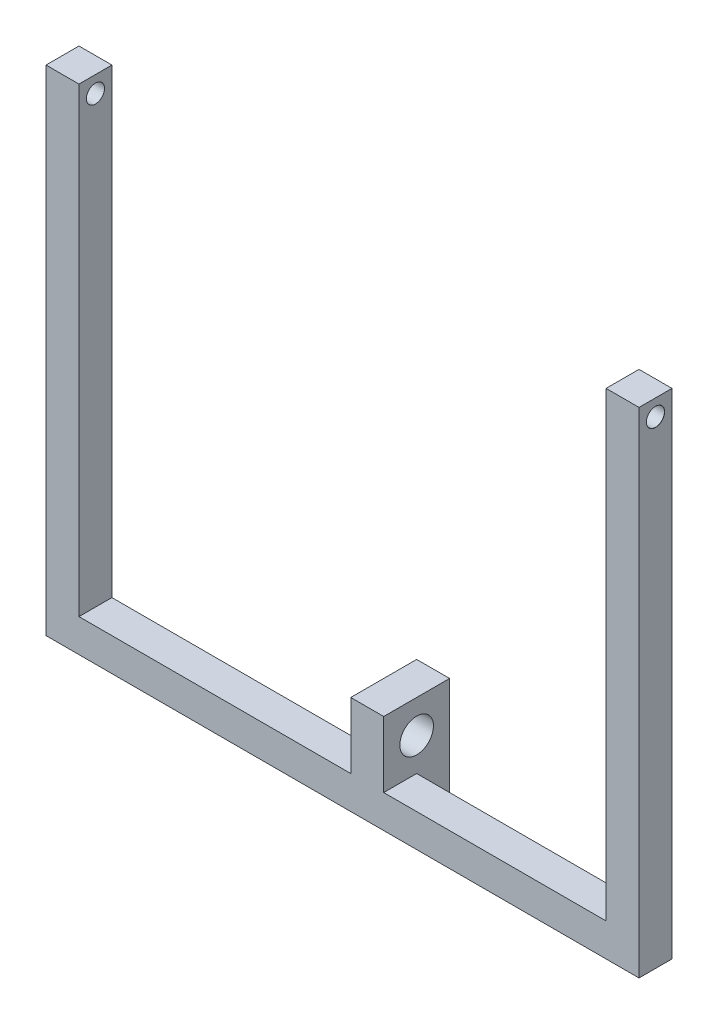
ISO-10303-21;
HEADER;
FILE_DESCRIPTION(('STEP AP214'),'2;1');
FILE_NAME('part.step','',(''),(''),'','','');
FILE_SCHEMA(('AUTOMOTIVE_DESIGN { 1 0 10303 214 1 1 1 1 }'));
ENDSEC;
DATA;
#1=APPLICATION_CONTEXT('core data for automotive mechanical design processes');
#2=APPLICATION_PROTOCOL_DEFINITION('international standard','automotive_design',2000,#1);
#3=PRODUCT_CONTEXT('',#1,'mechanical');
#4=PRODUCT('Part','Part','',(#3));
#5=PRODUCT_RELATED_PRODUCT_CATEGORY('part','',(#4));
#6=PRODUCT_DEFINITION_FORMATION('','',#4);
#7=PRODUCT_DEFINITION_CONTEXT('part definition',#1,'design');
#8=PRODUCT_DEFINITION('design','',#6,#7);
#9=PRODUCT_DEFINITION_SHAPE('','',#8);
#10=(LENGTH_UNIT() NAMED_UNIT(*) SI_UNIT(.MILLI.,.METRE.));
#11=(NAMED_UNIT(*) PLANE_ANGLE_UNIT() SI_UNIT($,.RADIAN.));
#12=(NAMED_UNIT(*) SI_UNIT($,.STERADIAN.) SOLID_ANGLE_UNIT());
#13=UNCERTAINTY_MEASURE_WITH_UNIT(LENGTH_MEASURE(1.E-05),#10,'distance_accuracy_value','');
#14=(GEOMETRIC_REPRESENTATION_CONTEXT(3) GLOBAL_UNCERTAINTY_ASSIGNED_CONTEXT((#13)) GLOBAL_UNIT_ASSIGNED_CONTEXT((#10,
#11,#12)) REPRESENTATION_CONTEXT('',''));
#15=CARTESIAN_POINT('',(0.,0.,0.));
#16=DIRECTION('',(0.,0.,1.));
#17=DIRECTION('',(1.,0.,0.));
#18=AXIS2_PLACEMENT_3D('',#15,#16,#17);
#19=CARTESIAN_POINT('',(0.,10.,0.));
#20=DIRECTION('',(0.,1.,0.));
#21=DIRECTION('',(0.,0.,1.));
#22=AXIS2_PLACEMENT_3D('',#19,#20,#21);
#23=PLANE('',#22);
#24=DIRECTION('',(-1.,0.,0.));
#25=VECTOR('',#24,1.);
#26=CARTESIAN_POINT('',(-90.,10.,-5.));
#27=LINE('',#26,#25);
#28=CARTESIAN_POINT('',(79.9999999999999,10.,-5.));
#29=VERTEX_POINT('',#28);
#30=CARTESIAN_POINT('',(12.5,10.,-5.));
#31=VERTEX_POINT('',#30);
#32=EDGE_CURVE('E224',#29,#31,#27,.T.);
#33=ORIENTED_EDGE('',*,*,#32,.T.);
#34=DIRECTION('',(0.,0.,-1.));
#35=VECTOR('',#34,1.);
#36=CARTESIAN_POINT('',(12.5,10.,-5.));
#37=LINE('',#36,#35);
#38=CARTESIAN_POINT('',(12.5,10.,5.));
#39=VERTEX_POINT('',#38);
#40=EDGE_CURVE('E275',#39,#31,#37,.T.);
#41=ORIENTED_EDGE('',*,*,#40,.F.);
#42=DIRECTION('',(1.,0.,0.));
#43=VECTOR('',#42,1.);
#44=CARTESIAN_POINT('',(-90.,10.,5.));
#45=LINE('',#44,#43);
#46=CARTESIAN_POINT('',(79.9999999999999,10.,5.));
#47=VERTEX_POINT('',#46);
#48=EDGE_CURVE('E226',#39,#47,#45,.T.);
#49=ORIENTED_EDGE('',*,*,#48,.T.);
#50=DIRECTION('',(0.,0.,1.));
#51=VECTOR('',#50,1.);
#52=CARTESIAN_POINT('',(80.,10.,-5.));
#53=LINE('',#52,#51);
#54=EDGE_CURVE('E192',#29,#47,#53,.T.);
#55=ORIENTED_EDGE('',*,*,#54,.F.);
#56=EDGE_LOOP('',(#33,#41,#49,#55));
#57=FACE_BOUND('',#56,.T.);
#58=ADVANCED_FACE('F39',(#57),#23,.T.);
#59=CARTESIAN_POINT('',(-90.,10.,-5.));
#60=DIRECTION('',(0.,0.,1.));
#61=DIRECTION('',(1.,0.,0.));
#62=AXIS2_PLACEMENT_3D('',#59,#60,#61);
#63=PLANE('',#62);
#64=DIRECTION('',(0.,-1.,0.));
#65=VECTOR('',#64,1.);
#66=CARTESIAN_POINT('',(12.5,0.,-5.));
#67=LINE('',#66,#65);
#68=CARTESIAN_POINT('',(12.5,0.,-5.));
#69=VERTEX_POINT('',#68);
#70=EDGE_CURVE('E63',#31,#69,#67,.T.);
#71=ORIENTED_EDGE('',*,*,#70,.F.);
#72=ORIENTED_EDGE('',*,*,#32,.F.);
#73=DIRECTION('',(0.,-1.,0.));
#74=VECTOR('',#73,1.);
#75=CARTESIAN_POINT('',(80.,150.,-5.));
#76=LINE('',#75,#74);
#77=CARTESIAN_POINT('',(80.,150.,-5.));
#78=VERTEX_POINT('',#77);
#79=EDGE_CURVE('E185',#78,#29,#76,.T.);
#80=ORIENTED_EDGE('',*,*,#79,.F.);
#81=DIRECTION('',(-1.,0.,0.));
#82=VECTOR('',#81,1.);
#83=CARTESIAN_POINT('',(90.,150.,-5.));
#84=LINE('',#83,#82);
#85=CARTESIAN_POINT('',(90.,150.,-5.));
#86=VERTEX_POINT('',#85);
#87=EDGE_CURVE('E201',#86,#78,#84,.T.);
#88=ORIENTED_EDGE('',*,*,#87,.F.);
#89=DIRECTION('',(0.,-1.,0.));
#90=VECTOR('',#89,1.);
#91=CARTESIAN_POINT('',(90.,10.,-5.));
#92=LINE('',#91,#90);
#93=CARTESIAN_POINT('',(90.,0.,-5.));
#94=VERTEX_POINT('',#93);
#95=EDGE_CURVE('E11',#86,#94,#92,.T.);
#96=ORIENTED_EDGE('',*,*,#95,.T.);
#97=DIRECTION('',(-1.,0.,0.));
#98=VECTOR('',#97,1.);
#99=CARTESIAN_POINT('',(-90.,0.,-5.));
#100=LINE('',#99,#98);
#101=EDGE_CURVE('E234',#94,#69,#100,.T.);
#102=ORIENTED_EDGE('',*,*,#101,.T.);
#103=EDGE_LOOP('',(#71,#72,#80,#88,#96,#102));
#104=FACE_BOUND('',#103,.T.);
#105=ADVANCED_FACE('F274',(#104),#63,.F.);
#106=DIRECTION('',(0.,0.,-1.));
#107=VECTOR('',#106,1.);
#108=CARTESIAN_POINT('',(2.5,10.,-5.));
#109=LINE('',#108,#107);
#110=CARTESIAN_POINT('',(2.49999999999997,10.,5.));
#111=VERTEX_POINT('',#110);
#112=CARTESIAN_POINT('',(2.49999999999997,10.,-5.));
#113=VERTEX_POINT('',#112);
#114=EDGE_CURVE('E55',#111,#113,#109,.T.);
#115=ORIENTED_EDGE('',*,*,#114,.T.);
#116=CARTESIAN_POINT('',(-80.,10.,-5.));
#117=VERTEX_POINT('',#116);
#118=EDGE_CURVE('E227',#113,#117,#27,.T.);
#119=ORIENTED_EDGE('',*,*,#118,.T.);
#120=DIRECTION('',(0.,0.,-1.));
#121=VECTOR('',#120,1.);
#122=CARTESIAN_POINT('',(-80.,10.,-5.));
#123=LINE('',#122,#121);
#124=CARTESIAN_POINT('',(-80.,10.,5.));
#125=VERTEX_POINT('',#124);
#126=EDGE_CURVE('E195',#125,#117,#123,.T.);
#127=ORIENTED_EDGE('',*,*,#126,.F.);
#128=EDGE_CURVE('E228',#125,#111,#45,.T.);
#129=ORIENTED_EDGE('',*,*,#128,.T.);
#130=EDGE_LOOP('',(#115,#119,#127,#129));
#131=FACE_BOUND('',#130,.T.);
#132=ADVANCED_FACE('F327',(#131),#23,.T.);
#133=CARTESIAN_POINT('',(90.,10.,-5.));
#134=DIRECTION('',(-1.,0.,0.));
#135=DIRECTION('',(0.,0.,1.));
#136=AXIS2_PLACEMENT_3D('',#133,#134,#135);
#137=PLANE('',#136);
#138=CARTESIAN_POINT('',(90.,145.,0.));
#139=DIRECTION('',(1.,0.,0.));
#140=DIRECTION('',(0.,0.,-1.));
#141=AXIS2_PLACEMENT_3D('',#138,#139,#140);
#142=CIRCLE('',#141,2.775);
#143=CARTESIAN_POINT('',(90.,145.,-2.775));
#144=VERTEX_POINT('',#143);
#145=EDGE_CURVE('E168',#144,#144,#142,.T.);
#146=ORIENTED_EDGE('',*,*,#145,.F.);
#147=EDGE_LOOP('',(#146));
#148=FACE_BOUND('',#147,.T.);
#149=DIRECTION('',(0.,0.,-1.));
#150=VECTOR('',#149,1.);
#151=CARTESIAN_POINT('',(90.,0.,-5.));
#152=LINE('',#151,#150);
#153=CARTESIAN_POINT('',(90.,0.,5.));
#154=VERTEX_POINT('',#153);
#155=EDGE_CURVE('E223',#154,#94,#152,.T.);
#156=ORIENTED_EDGE('',*,*,#155,.T.);
#157=ORIENTED_EDGE('',*,*,#95,.F.);
#158=DIRECTION('',(0.,0.,-1.));
#159=VECTOR('',#158,1.);
#160=CARTESIAN_POINT('',(90.,150.,-5.));
#161=LINE('',#160,#159);
#162=CARTESIAN_POINT('',(90.,150.,5.));
#163=VERTEX_POINT('',#162);
#164=EDGE_CURVE('E196',#163,#86,#161,.T.);
#165=ORIENTED_EDGE('',*,*,#164,.F.);
#166=DIRECTION('',(0.,-1.,0.));
#167=VECTOR('',#166,1.);
#168=CARTESIAN_POINT('',(90.,10.,5.));
#169=LINE('',#168,#167);
#170=EDGE_CURVE('E230',#163,#154,#169,.T.);
#171=ORIENTED_EDGE('',*,*,#170,.T.);
#172=EDGE_LOOP('',(#156,#157,#165,#171));
#173=FACE_BOUND('',#172,.T.);
#174=ADVANCED_FACE('F41',(#148,#173),#137,.F.);
#175=ORIENTED_EDGE('',*,*,#118,.F.);
#176=DIRECTION('',(0.,-1.,0.));
#177=VECTOR('',#176,1.);
#178=CARTESIAN_POINT('',(2.5,0.,-5.));
#179=LINE('',#178,#177);
#180=CARTESIAN_POINT('',(2.5,0.,-5.));
#181=VERTEX_POINT('',#180);
#182=EDGE_CURVE('E288',#113,#181,#179,.T.);
#183=ORIENTED_EDGE('',*,*,#182,.T.);
#184=CARTESIAN_POINT('',(-90.,0.,-5.));
#185=VERTEX_POINT('',#184);
#186=EDGE_CURVE('E233',#181,#185,#100,.T.);
#187=ORIENTED_EDGE('',*,*,#186,.T.);
#188=DIRECTION('',(0.,-1.,0.));
#189=VECTOR('',#188,1.);
#190=CARTESIAN_POINT('',(-90.,10.,-5.));
#191=LINE('',#190,#189);
#192=CARTESIAN_POINT('',(-90.,150.,-5.));
#193=VERTEX_POINT('',#192);
#194=EDGE_CURVE('E48',#193,#185,#191,.T.);
#195=ORIENTED_EDGE('',*,*,#194,.F.);
#196=DIRECTION('',(-1.,0.,0.));
#197=VECTOR('',#196,1.);
#198=CARTESIAN_POINT('',(-90.,150.,-5.));
#199=LINE('',#198,#197);
#200=CARTESIAN_POINT('',(-80.,150.,-5.));
#201=VERTEX_POINT('',#200);
#202=EDGE_CURVE('E212',#201,#193,#199,.T.);
#203=ORIENTED_EDGE('',*,*,#202,.F.);
#204=DIRECTION('',(0.,-1.,0.));
#205=VECTOR('',#204,1.);
#206=CARTESIAN_POINT('',(-80.,150.,-5.));
#207=LINE('',#206,#205);
#208=EDGE_CURVE('E215',#201,#117,#207,.T.);
#209=ORIENTED_EDGE('',*,*,#208,.T.);
#210=EDGE_LOOP('',(#175,#183,#187,#195,#203,#209));
#211=FACE_BOUND('',#210,.T.);
#212=ADVANCED_FACE('F332',(#211),#63,.F.);
#213=CARTESIAN_POINT('',(-90.,10.,-5.));
#214=DIRECTION('',(1.,0.,0.));
#215=DIRECTION('',(0.,0.,-1.));
#216=AXIS2_PLACEMENT_3D('',#213,#214,#215);
#217=PLANE('',#216);
#218=CARTESIAN_POINT('',(-90.,145.,0.));
#219=DIRECTION('',(1.,0.,0.));
#220=DIRECTION('',(0.,0.,-1.));
#221=AXIS2_PLACEMENT_3D('',#218,#219,#220);
#222=CIRCLE('',#221,2.74999999999995);
#223=CARTESIAN_POINT('',(-90.,145.,-2.74999999999995));
#224=VERTEX_POINT('',#223);
#225=EDGE_CURVE('E179',#224,#224,#222,.T.);
#226=ORIENTED_EDGE('',*,*,#225,.T.);
#227=EDGE_LOOP('',(#226));
#228=FACE_BOUND('',#227,.T.);
#229=DIRECTION('',(0.,0.,1.));
#230=VECTOR('',#229,1.);
#231=CARTESIAN_POINT('',(-90.,0.,-5.));
#232=LINE('',#231,#230);
#233=CARTESIAN_POINT('',(-90.,0.,5.));
#234=VERTEX_POINT('',#233);
#235=EDGE_CURVE('E236',#185,#234,#232,.T.);
#236=ORIENTED_EDGE('',*,*,#235,.T.);
#237=DIRECTION('',(0.,-1.,0.));
#238=VECTOR('',#237,1.);
#239=CARTESIAN_POINT('',(-90.,10.,5.));
#240=LINE('',#239,#238);
#241=CARTESIAN_POINT('',(-90.,150.,5.));
#242=VERTEX_POINT('',#241);
#243=EDGE_CURVE('E242',#242,#234,#240,.T.);
#244=ORIENTED_EDGE('',*,*,#243,.F.);
#245=DIRECTION('',(0.,0.,1.));
#246=VECTOR('',#245,1.);
#247=CARTESIAN_POINT('',(-90.,150.,-5.));
#248=LINE('',#247,#246);
#249=EDGE_CURVE('E205',#193,#242,#248,.T.);
#250=ORIENTED_EDGE('',*,*,#249,.F.);
#251=ORIENTED_EDGE('',*,*,#194,.T.);
#252=EDGE_LOOP('',(#236,#244,#250,#251));
#253=FACE_BOUND('',#252,.T.);
#254=ADVANCED_FACE('F249',(#228,#253),#217,.F.);
#255=CARTESIAN_POINT('',(-90.,10.,5.));
#256=DIRECTION('',(0.,0.,-1.));
#257=DIRECTION('',(-1.,0.,0.));
#258=AXIS2_PLACEMENT_3D('',#255,#256,#257);
#259=PLANE('',#258);
#260=DIRECTION('',(1.,0.,0.));
#261=VECTOR('',#260,1.);
#262=CARTESIAN_POINT('',(-90.,0.,5.));
#263=LINE('',#262,#261);
#264=EDGE_CURVE('E238',#234,#154,#263,.T.);
#265=ORIENTED_EDGE('',*,*,#264,.T.);
#266=ORIENTED_EDGE('',*,*,#170,.F.);
#267=DIRECTION('',(1.,0.,0.));
#268=VECTOR('',#267,1.);
#269=CARTESIAN_POINT('',(90.,150.,5.));
#270=LINE('',#269,#268);
#271=CARTESIAN_POINT('',(80.,150.,5.));
#272=VERTEX_POINT('',#271);
#273=EDGE_CURVE('E191',#272,#163,#270,.T.);
#274=ORIENTED_EDGE('',*,*,#273,.F.);
#275=DIRECTION('',(0.,-1.,0.));
#276=VECTOR('',#275,1.);
#277=CARTESIAN_POINT('',(80.,150.,5.));
#278=LINE('',#277,#276);
#279=EDGE_CURVE('E188',#272,#47,#278,.T.);
#280=ORIENTED_EDGE('',*,*,#279,.T.);
#281=ORIENTED_EDGE('',*,*,#48,.F.);
#282=DIRECTION('',(0.,-1.,0.));
#283=VECTOR('',#282,1.);
#284=CARTESIAN_POINT('',(12.5,10.,5.));
#285=LINE('',#284,#283);
#286=CARTESIAN_POINT('',(12.5,30.,5.));
#287=VERTEX_POINT('',#286);
#288=EDGE_CURVE('E153',#287,#39,#285,.T.);
#289=ORIENTED_EDGE('',*,*,#288,.F.);
#290=DIRECTION('',(-1.,0.,0.));
#291=VECTOR('',#290,1.);
#292=CARTESIAN_POINT('',(12.5,30.,5.));
#293=LINE('',#292,#291);
#294=CARTESIAN_POINT('',(2.5,30.,5.));
#295=VERTEX_POINT('',#294);
#296=EDGE_CURVE('E149',#287,#295,#293,.T.);
#297=ORIENTED_EDGE('',*,*,#296,.T.);
#298=DIRECTION('',(0.,-1.,0.));
#299=VECTOR('',#298,1.);
#300=CARTESIAN_POINT('',(2.5,10.,5.));
#301=LINE('',#300,#299);
#302=EDGE_CURVE('E284',#295,#111,#301,.T.);
#303=ORIENTED_EDGE('',*,*,#302,.T.);
#304=ORIENTED_EDGE('',*,*,#128,.F.);
#305=DIRECTION('',(0.,-1.,0.));
#306=VECTOR('',#305,1.);
#307=CARTESIAN_POINT('',(-80.,150.,5.));
#308=LINE('',#307,#306);
#309=CARTESIAN_POINT('',(-80.,150.,5.));
#310=VERTEX_POINT('',#309);
#311=EDGE_CURVE('E220',#310,#125,#308,.T.);
#312=ORIENTED_EDGE('',*,*,#311,.F.);
#313=DIRECTION('',(1.,0.,0.));
#314=VECTOR('',#313,1.);
#315=CARTESIAN_POINT('',(-90.,150.,5.));
#316=LINE('',#315,#314);
#317=EDGE_CURVE('E208',#242,#310,#316,.T.);
#318=ORIENTED_EDGE('',*,*,#317,.F.);
#319=ORIENTED_EDGE('',*,*,#243,.T.);
#320=EDGE_LOOP('',(#265,#266,#274,#280,#281,#289,#297,#303,#304,#312,#318,#319));
#321=FACE_BOUND('',#320,.T.);
#322=ADVANCED_FACE('F258',(#321),#259,.F.);
#323=CARTESIAN_POINT('',(0.,0.,0.));
#324=DIRECTION('',(0.,1.,0.));
#325=DIRECTION('',(0.,0.,1.));
#326=AXIS2_PLACEMENT_3D('',#323,#324,#325);
#327=PLANE('',#326);
#328=ORIENTED_EDGE('',*,*,#155,.F.);
#329=ORIENTED_EDGE('',*,*,#264,.F.);
#330=ORIENTED_EDGE('',*,*,#235,.F.);
#331=ORIENTED_EDGE('',*,*,#186,.F.);
#332=DIRECTION('',(0.,0.,-1.));
#333=VECTOR('',#332,1.);
#334=CARTESIAN_POINT('',(2.5,0.,-5.));
#335=LINE('',#334,#333);
#336=CARTESIAN_POINT('',(2.5,0.,-15.));
#337=VERTEX_POINT('',#336);
#338=EDGE_CURVE('E163',#181,#337,#335,.T.);
#339=ORIENTED_EDGE('',*,*,#338,.T.);
#340=DIRECTION('',(-1.,0.,0.));
#341=VECTOR('',#340,1.);
#342=CARTESIAN_POINT('',(12.5,0.,-15.));
#343=LINE('',#342,#341);
#344=CARTESIAN_POINT('',(12.5,0.,-15.));
#345=VERTEX_POINT('',#344);
#346=EDGE_CURVE('E173',#345,#337,#343,.T.);
#347=ORIENTED_EDGE('',*,*,#346,.F.);
#348=DIRECTION('',(0.,0.,-1.));
#349=VECTOR('',#348,1.);
#350=CARTESIAN_POINT('',(12.5,0.,-5.));
#351=LINE('',#350,#349);
#352=EDGE_CURVE('E159',#69,#345,#351,.T.);
#353=ORIENTED_EDGE('',*,*,#352,.F.);
#354=ORIENTED_EDGE('',*,*,#101,.F.);
#355=EDGE_LOOP('',(#328,#329,#330,#331,#339,#347,#353,#354));
#356=FACE_BOUND('',#355,.T.);
#357=ADVANCED_FACE('F255',(#356),#327,.F.);
#358=CARTESIAN_POINT('',(-80.,150.,-5.));
#359=DIRECTION('',(-1.,0.,0.));
#360=DIRECTION('',(0.,0.,1.));
#361=AXIS2_PLACEMENT_3D('',#358,#359,#360);
#362=PLANE('',#361);
#363=CARTESIAN_POINT('',(-80.,145.,0.));
#364=DIRECTION('',(-1.,0.,0.));
#365=DIRECTION('',(0.,0.,1.));
#366=AXIS2_PLACEMENT_3D('',#363,#364,#365);
#367=CIRCLE('',#366,2.74999999999996);
#368=CARTESIAN_POINT('',(-80.,145.,2.74999999999996));
#369=VERTEX_POINT('',#368);
#370=EDGE_CURVE('E182',#369,#369,#367,.T.);
#371=ORIENTED_EDGE('',*,*,#370,.T.);
#372=EDGE_LOOP('',(#371));
#373=FACE_BOUND('',#372,.T.);
#374=ORIENTED_EDGE('',*,*,#126,.T.);
#375=ORIENTED_EDGE('',*,*,#208,.F.);
#376=DIRECTION('',(0.,0.,-1.));
#377=VECTOR('',#376,1.);
#378=CARTESIAN_POINT('',(-80.,150.,-5.));
#379=LINE('',#378,#377);
#380=EDGE_CURVE('E210',#310,#201,#379,.T.);
#381=ORIENTED_EDGE('',*,*,#380,.F.);
#382=ORIENTED_EDGE('',*,*,#311,.T.);
#383=EDGE_LOOP('',(#374,#375,#381,#382));
#384=FACE_BOUND('',#383,.T.);
#385=ADVANCED_FACE('F368',(#373,#384),#362,.F.);
#386=CARTESIAN_POINT('',(0.,150.,0.));
#387=DIRECTION('',(0.,1.,0.));
#388=DIRECTION('',(0.,0.,1.));
#389=AXIS2_PLACEMENT_3D('',#386,#387,#388);
#390=PLANE('',#389);
#391=ORIENTED_EDGE('',*,*,#249,.T.);
#392=ORIENTED_EDGE('',*,*,#317,.T.);
#393=ORIENTED_EDGE('',*,*,#380,.T.);
#394=ORIENTED_EDGE('',*,*,#202,.T.);
#395=EDGE_LOOP('',(#391,#392,#393,#394));
#396=FACE_BOUND('',#395,.T.);
#397=ADVANCED_FACE('F364',(#396),#390,.T.);
#398=CARTESIAN_POINT('',(80.,150.,-5.));
#399=DIRECTION('',(1.,0.,0.));
#400=DIRECTION('',(0.,0.,-1.));
#401=AXIS2_PLACEMENT_3D('',#398,#399,#400);
#402=PLANE('',#401);
#403=CARTESIAN_POINT('',(80.,145.,0.));
#404=DIRECTION('',(1.,0.,0.));
#405=DIRECTION('',(0.,0.,-1.));
#406=AXIS2_PLACEMENT_3D('',#403,#404,#405);
#407=CIRCLE('',#406,2.74999999999996);
#408=CARTESIAN_POINT('',(80.,145.,-2.74999999999996));
#409=VERTEX_POINT('',#408);
#410=EDGE_CURVE('E43',#409,#409,#407,.T.);
#411=ORIENTED_EDGE('',*,*,#410,.T.);
#412=EDGE_LOOP('',(#411));
#413=FACE_BOUND('',#412,.T.);
#414=ORIENTED_EDGE('',*,*,#54,.T.);
#415=ORIENTED_EDGE('',*,*,#279,.F.);
#416=DIRECTION('',(0.,0.,1.));
#417=VECTOR('',#416,1.);
#418=CARTESIAN_POINT('',(80.,150.,-5.));
#419=LINE('',#418,#417);
#420=EDGE_CURVE('E199',#78,#272,#419,.T.);
#421=ORIENTED_EDGE('',*,*,#420,.F.);
#422=ORIENTED_EDGE('',*,*,#79,.T.);
#423=EDGE_LOOP('',(#414,#415,#421,#422));
#424=FACE_BOUND('',#423,.T.);
#425=ADVANCED_FACE('F271',(#413,#424),#402,.F.);
#426=CARTESIAN_POINT('',(0.,150.,0.));
#427=DIRECTION('',(0.,-1.,0.));
#428=DIRECTION('',(0.,0.,-1.));
#429=AXIS2_PLACEMENT_3D('',#426,#427,#428);
#430=PLANE('',#429);
#431=ORIENTED_EDGE('',*,*,#164,.T.);
#432=ORIENTED_EDGE('',*,*,#87,.T.);
#433=ORIENTED_EDGE('',*,*,#420,.T.);
#434=ORIENTED_EDGE('',*,*,#273,.T.);
#435=EDGE_LOOP('',(#431,#432,#433,#434));
#436=FACE_BOUND('',#435,.T.);
#437=ADVANCED_FACE('F265',(#436),#430,.F.);
#438=CARTESIAN_POINT('',(90.,145.,0.));
#439=DIRECTION('',(1.,0.,0.));
#440=DIRECTION('',(0.,0.,-1.));
#441=AXIS2_PLACEMENT_3D('',#438,#439,#440);
#442=CYLINDRICAL_SURFACE('',#441,2.74999999999996);
#443=CARTESIAN_POINT('',(89.975,145.,0.));
#444=DIRECTION('',(1.,0.,0.));
#445=DIRECTION('',(0.,0.,-1.));
#446=AXIS2_PLACEMENT_3D('',#443,#444,#445);
#447=CIRCLE('',#446,2.74999999999997);
#448=CARTESIAN_POINT('',(89.975,145.,-2.74999999999997));
#449=VERTEX_POINT('',#448);
#450=EDGE_CURVE('E171',#449,#449,#447,.T.);
#451=ORIENTED_EDGE('',*,*,#450,.T.);
#452=EDGE_LOOP('',(#451));
#453=FACE_BOUND('',#452,.T.);
#454=ORIENTED_EDGE('',*,*,#410,.F.);
#455=EDGE_LOOP('',(#454));
#456=FACE_BOUND('',#455,.T.);
#457=ADVANCED_FACE('F350',(#453,#456),#442,.F.);
#458=CARTESIAN_POINT('',(90.,145.,0.));
#459=DIRECTION('',(1.,0.,0.));
#460=DIRECTION('',(0.,0.,-1.));
#461=AXIS2_PLACEMENT_3D('',#458,#459,#460);
#462=CONICAL_SURFACE('',#461,2.775,0.785398163397448);
#463=ORIENTED_EDGE('',*,*,#450,.F.);
#464=EDGE_LOOP('',(#463));
#465=FACE_BOUND('',#464,.T.);
#466=ORIENTED_EDGE('',*,*,#145,.T.);
#467=EDGE_LOOP('',(#466));
#468=FACE_BOUND('',#467,.T.);
#469=ADVANCED_FACE('F347',(#465,#468),#462,.F.);
#470=ORIENTED_EDGE('',*,*,#225,.F.);
#471=EDGE_LOOP('',(#470));
#472=FACE_BOUND('',#471,.T.);
#473=ORIENTED_EDGE('',*,*,#370,.F.);
#474=EDGE_LOOP('',(#473));
#475=FACE_BOUND('',#474,.T.);
#476=ADVANCED_FACE('F349',(#472,#475),#442,.F.);
#477=CARTESIAN_POINT('',(12.5,0.,-15.));
#478=DIRECTION('',(0.,0.,1.));
#479=DIRECTION('',(1.,0.,0.));
#480=AXIS2_PLACEMENT_3D('',#477,#478,#479);
#481=PLANE('',#480);
#482=DIRECTION('',(0.,1.,0.));
#483=VECTOR('',#482,1.);
#484=CARTESIAN_POINT('',(2.5,0.,-15.));
#485=LINE('',#484,#483);
#486=CARTESIAN_POINT('',(2.5,30.,-15.));
#487=VERTEX_POINT('',#486);
#488=EDGE_CURVE('E167',#337,#487,#485,.T.);
#489=ORIENTED_EDGE('',*,*,#488,.T.);
#490=DIRECTION('',(-1.,0.,0.));
#491=VECTOR('',#490,1.);
#492=CARTESIAN_POINT('',(12.5,30.,-15.));
#493=LINE('',#492,#491);
#494=CARTESIAN_POINT('',(12.5,30.,-15.));
#495=VERTEX_POINT('',#494);
#496=EDGE_CURVE('E146',#495,#487,#493,.T.);
#497=ORIENTED_EDGE('',*,*,#496,.F.);
#498=DIRECTION('',(0.,1.,0.));
#499=VECTOR('',#498,1.);
#500=CARTESIAN_POINT('',(12.5,0.,-15.));
#501=LINE('',#500,#499);
#502=EDGE_CURVE('E154',#345,#495,#501,.T.);
#503=ORIENTED_EDGE('',*,*,#502,.F.);
#504=ORIENTED_EDGE('',*,*,#346,.T.);
#505=EDGE_LOOP('',(#489,#497,#503,#504));
#506=FACE_BOUND('',#505,.T.);
#507=ADVANCED_FACE('F165',(#506),#481,.F.);
#508=CARTESIAN_POINT('',(12.5,30.,5.));
#509=DIRECTION('',(0.,-1.,0.));
#510=DIRECTION('',(0.,0.,-1.));
#511=AXIS2_PLACEMENT_3D('',#508,#509,#510);
#512=PLANE('',#511);
#513=DIRECTION('',(0.,0.,1.));
#514=VECTOR('',#513,1.);
#515=CARTESIAN_POINT('',(2.5,30.,5.));
#516=LINE('',#515,#514);
#517=EDGE_CURVE('E281',#487,#295,#516,.T.);
#518=ORIENTED_EDGE('',*,*,#517,.T.);
#519=ORIENTED_EDGE('',*,*,#296,.F.);
#520=DIRECTION('',(0.,0.,1.));
#521=VECTOR('',#520,1.);
#522=CARTESIAN_POINT('',(12.5,30.,5.));
#523=LINE('',#522,#521);
#524=EDGE_CURVE('E142',#495,#287,#523,.T.);
#525=ORIENTED_EDGE('',*,*,#524,.F.);
#526=ORIENTED_EDGE('',*,*,#496,.T.);
#527=EDGE_LOOP('',(#518,#519,#525,#526));
#528=FACE_BOUND('',#527,.T.);
#529=ADVANCED_FACE('F144',(#528),#512,.F.);
#530=CARTESIAN_POINT('',(12.5,0.,0.));
#531=DIRECTION('',(-1.,0.,0.));
#532=DIRECTION('',(0.,0.,1.));
#533=AXIS2_PLACEMENT_3D('',#530,#531,#532);
#534=PLANE('',#533);
#535=CARTESIAN_POINT('',(12.5,20.,-5.));
#536=DIRECTION('',(-1.,0.,0.));
#537=DIRECTION('',(0.,0.,1.));
#538=AXIS2_PLACEMENT_3D('',#535,#536,#537);
#539=CIRCLE('',#538,5.10000000000001);
#540=CARTESIAN_POINT('',(12.5,20.,0.100000000000012));
#541=VERTEX_POINT('',#540);
#542=EDGE_CURVE('E282',#541,#541,#539,.T.);
#543=ORIENTED_EDGE('',*,*,#542,.T.);
#544=EDGE_LOOP('',(#543));
#545=FACE_BOUND('',#544,.T.);
#546=ORIENTED_EDGE('',*,*,#502,.T.);
#547=ORIENTED_EDGE('',*,*,#524,.T.);
#548=ORIENTED_EDGE('',*,*,#288,.T.);
#549=ORIENTED_EDGE('',*,*,#40,.T.);
#550=ORIENTED_EDGE('',*,*,#70,.T.);
#551=ORIENTED_EDGE('',*,*,#352,.T.);
#552=EDGE_LOOP('',(#546,#547,#548,#549,#550,#551));
#553=FACE_BOUND('',#552,.T.);
#554=ADVANCED_FACE('F157',(#545,#553),#534,.F.);
#555=CARTESIAN_POINT('',(2.5,0.,0.));
#556=DIRECTION('',(-1.,0.,0.));
#557=DIRECTION('',(0.,0.,1.));
#558=AXIS2_PLACEMENT_3D('',#555,#556,#557);
#559=PLANE('',#558);
#560=CARTESIAN_POINT('',(2.5,20.,-5.));
#561=DIRECTION('',(-1.,0.,0.));
#562=DIRECTION('',(0.,0.,1.));
#563=AXIS2_PLACEMENT_3D('',#560,#561,#562);
#564=CIRCLE('',#563,5.70000000000001);
#565=CARTESIAN_POINT('',(2.5,20.,0.700000000000013));
#566=VERTEX_POINT('',#565);
#567=EDGE_CURVE('E306',#566,#566,#564,.T.);
#568=ORIENTED_EDGE('',*,*,#567,.F.);
#569=EDGE_LOOP('',(#568));
#570=FACE_BOUND('',#569,.T.);
#571=ORIENTED_EDGE('',*,*,#488,.F.);
#572=ORIENTED_EDGE('',*,*,#338,.F.);
#573=ORIENTED_EDGE('',*,*,#182,.F.);
#574=ORIENTED_EDGE('',*,*,#114,.F.);
#575=ORIENTED_EDGE('',*,*,#302,.F.);
#576=ORIENTED_EDGE('',*,*,#517,.F.);
#577=EDGE_LOOP('',(#571,#572,#573,#574,#575,#576));
#578=FACE_BOUND('',#577,.T.);
#579=ADVANCED_FACE('F293',(#570,#578),#559,.T.);
#580=CARTESIAN_POINT('',(2.5,20.,-5.));
#581=DIRECTION('',(-1.,0.,0.));
#582=DIRECTION('',(0.,0.,1.));
#583=AXIS2_PLACEMENT_3D('',#580,#581,#582);
#584=CYLINDRICAL_SURFACE('',#583,5.10000000000001);
#585=ORIENTED_EDGE('',*,*,#542,.F.);
#586=EDGE_LOOP('',(#585));
#587=FACE_BOUND('',#586,.T.);
#588=CARTESIAN_POINT('',(3.1,20.,-5.));
#589=DIRECTION('',(-1.,0.,0.));
#590=DIRECTION('',(0.,0.,1.));
#591=AXIS2_PLACEMENT_3D('',#588,#589,#590);
#592=CIRCLE('',#591,5.10000000000001);
#593=CARTESIAN_POINT('',(3.1,20.,0.10000000000001));
#594=VERTEX_POINT('',#593);
#595=EDGE_CURVE('E300',#594,#594,#592,.T.);
#596=ORIENTED_EDGE('',*,*,#595,.T.);
#597=EDGE_LOOP('',(#596));
#598=FACE_BOUND('',#597,.T.);
#599=ADVANCED_FACE('F313',(#587,#598),#584,.F.);
#600=CARTESIAN_POINT('',(3.1,25.1,-5.));
#601=DIRECTION('',(1.,0.,0.));
#602=DIRECTION('',(0.,0.,-1.));
#603=AXIS2_PLACEMENT_3D('',#600,#601,#602);
#604=PLANE('',#603);
#605=ORIENTED_EDGE('',*,*,#595,.F.);
#606=EDGE_LOOP('',(#605));
#607=FACE_BOUND('',#606,.T.);
#608=CARTESIAN_POINT('',(3.1,20.,-5.));
#609=DIRECTION('',(-1.,0.,0.));
#610=DIRECTION('',(0.,0.,1.));
#611=AXIS2_PLACEMENT_3D('',#608,#609,#610);
#612=CIRCLE('',#611,5.70000000000001);
#613=CARTESIAN_POINT('',(3.1,20.,0.700000000000013));
#614=VERTEX_POINT('',#613);
#615=EDGE_CURVE('E303',#614,#614,#612,.T.);
#616=ORIENTED_EDGE('',*,*,#615,.T.);
#617=EDGE_LOOP('',(#616));
#618=FACE_BOUND('',#617,.T.);
#619=ADVANCED_FACE('F319',(#607,#618),#604,.F.);
#620=CARTESIAN_POINT('',(2.5,20.,-5.));
#621=DIRECTION('',(-1.,0.,0.));
#622=DIRECTION('',(0.,0.,1.));
#623=AXIS2_PLACEMENT_3D('',#620,#621,#622);
#624=CYLINDRICAL_SURFACE('',#623,5.70000000000001);
#625=ORIENTED_EDGE('',*,*,#615,.F.);
#626=EDGE_LOOP('',(#625));
#627=FACE_BOUND('',#626,.T.);
#628=ORIENTED_EDGE('',*,*,#567,.T.);
#629=EDGE_LOOP('',(#628));
#630=FACE_BOUND('',#629,.T.);
#631=ADVANCED_FACE('F310',(#627,#630),#624,.F.);
#632=CLOSED_SHELL('',(#58,#105,#132,#174,#212,#254,#322,#357,#385,#397,#425,#437,#457,#469,#476,
#507,#529,#554,#579,#599,#619,#631));
#633=MANIFOLD_SOLID_BREP('B2',#632);
#634=ADVANCED_BREP_SHAPE_REPRESENTATION('',(#18,#633),#14);
#635=SHAPE_DEFINITION_REPRESENTATION(#9,#634);
ENDSEC;
END-ISO-10303-21;
